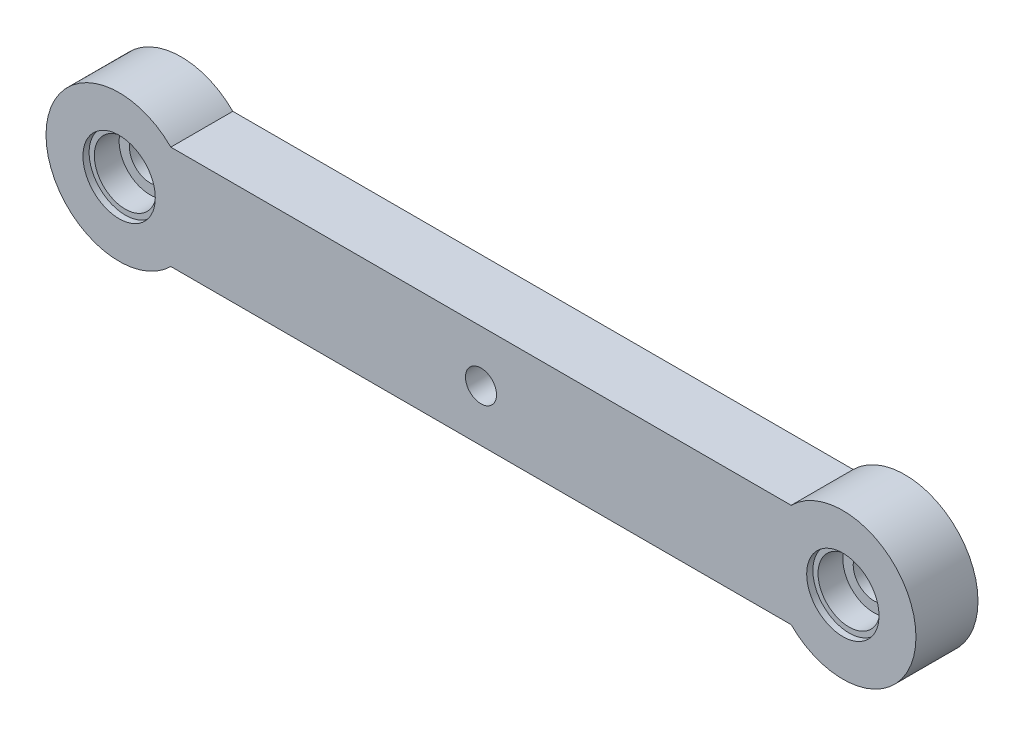
ISO-10303-21;
HEADER;
FILE_DESCRIPTION(('STEP AP214'),'2;1');
FILE_NAME('part.step','',(''),(''),'','','');
FILE_SCHEMA(('AUTOMOTIVE_DESIGN { 1 0 10303 214 1 1 1 1 }'));
ENDSEC;
DATA;
#1=APPLICATION_CONTEXT('core data for automotive mechanical design processes');
#2=APPLICATION_PROTOCOL_DEFINITION('international standard','automotive_design',2000,#1);
#3=PRODUCT_CONTEXT('',#1,'mechanical');
#4=PRODUCT('Part','Part','',(#3));
#5=PRODUCT_RELATED_PRODUCT_CATEGORY('part','',(#4));
#6=PRODUCT_DEFINITION_FORMATION('','',#4);
#7=PRODUCT_DEFINITION_CONTEXT('part definition',#1,'design');
#8=PRODUCT_DEFINITION('design','',#6,#7);
#9=PRODUCT_DEFINITION_SHAPE('','',#8);
#10=(LENGTH_UNIT() NAMED_UNIT(*) SI_UNIT(.MILLI.,.METRE.));
#11=(NAMED_UNIT(*) PLANE_ANGLE_UNIT() SI_UNIT($,.RADIAN.));
#12=(NAMED_UNIT(*) SI_UNIT($,.STERADIAN.) SOLID_ANGLE_UNIT());
#13=UNCERTAINTY_MEASURE_WITH_UNIT(LENGTH_MEASURE(1.E-05),#10,'distance_accuracy_value','');
#14=(GEOMETRIC_REPRESENTATION_CONTEXT(3) GLOBAL_UNCERTAINTY_ASSIGNED_CONTEXT((#13)) GLOBAL_UNIT_ASSIGNED_CONTEXT((#10,
#11,#12)) REPRESENTATION_CONTEXT('',''));
#15=CARTESIAN_POINT('',(0.,0.,0.));
#16=DIRECTION('',(0.,0.,1.));
#17=DIRECTION('',(1.,0.,0.));
#18=AXIS2_PLACEMENT_3D('',#15,#16,#17);
#19=CARTESIAN_POINT('',(0.,0.,6.));
#20=DIRECTION('',(0.,0.,-1.));
#21=DIRECTION('',(-1.,0.,0.));
#22=AXIS2_PLACEMENT_3D('',#19,#20,#21);
#23=PLANE('',#22);
#24=CARTESIAN_POINT('',(0.,0.,6.));
#25=DIRECTION('',(0.,0.,-1.));
#26=DIRECTION('',(-1.,0.,0.));
#27=AXIS2_PLACEMENT_3D('',#24,#25,#26);
#28=CIRCLE('',#27,1.5);
#29=CARTESIAN_POINT('',(-1.5,0.,6.));
#30=VERTEX_POINT('',#29);
#31=EDGE_CURVE('E233',#30,#30,#28,.F.);
#32=ORIENTED_EDGE('',*,*,#31,.F.);
#33=EDGE_LOOP('',(#32));
#34=FACE_BOUND('',#33,.T.);
#35=CARTESIAN_POINT('',(-34.9999999999999,0.,6.));
#36=DIRECTION('',(0.,0.,1.));
#37=DIRECTION('',(1.,0.,0.));
#38=AXIS2_PLACEMENT_3D('',#35,#36,#37);
#39=CIRCLE('',#38,7.07106781186556);
#40=CARTESIAN_POINT('',(-29.9999999999998,5.,6.));
#41=VERTEX_POINT('',#40);
#42=CARTESIAN_POINT('',(-29.9999999999997,-5.,6.));
#43=VERTEX_POINT('',#42);
#44=EDGE_CURVE('E168',#41,#43,#39,.T.);
#45=ORIENTED_EDGE('',*,*,#44,.T.);
#46=DIRECTION('',(1.,0.,0.));
#47=VECTOR('',#46,1.);
#48=CARTESIAN_POINT('',(-40.,-5.,6.));
#49=LINE('',#48,#47);
#50=CARTESIAN_POINT('',(29.9999999999998,-5.,6.));
#51=VERTEX_POINT('',#50);
#52=EDGE_CURVE('E177',#43,#51,#49,.T.);
#53=ORIENTED_EDGE('',*,*,#52,.T.);
#54=CARTESIAN_POINT('',(34.9999999999999,0.,6.));
#55=DIRECTION('',(0.,0.,-1.));
#56=DIRECTION('',(-1.,0.,0.));
#57=AXIS2_PLACEMENT_3D('',#54,#55,#56);
#58=CIRCLE('',#57,7.07106781186556);
#59=CARTESIAN_POINT('',(29.9999999999998,5.,6.));
#60=VERTEX_POINT('',#59);
#61=EDGE_CURVE('E169',#60,#51,#58,.T.);
#62=ORIENTED_EDGE('',*,*,#61,.F.);
#63=DIRECTION('',(1.,0.,0.));
#64=VECTOR('',#63,1.);
#65=CARTESIAN_POINT('',(-40.,5.,6.));
#66=LINE('',#65,#64);
#67=EDGE_CURVE('E190',#41,#60,#66,.T.);
#68=ORIENTED_EDGE('',*,*,#67,.F.);
#69=EDGE_LOOP('',(#45,#53,#62,#68));
#70=FACE_BOUND('',#69,.T.);
#71=CARTESIAN_POINT('',(34.9999999999999,0.,6.));
#72=DIRECTION('',(0.,0.,-1.));
#73=DIRECTION('',(-1.,0.,0.));
#74=AXIS2_PLACEMENT_3D('',#71,#72,#73);
#75=CIRCLE('',#74,3.5);
#76=CARTESIAN_POINT('',(31.4999999999999,0.,6.));
#77=VERTEX_POINT('',#76);
#78=EDGE_CURVE('E230',#77,#77,#75,.T.);
#79=ORIENTED_EDGE('',*,*,#78,.T.);
#80=EDGE_LOOP('',(#79));
#81=FACE_BOUND('',#80,.T.);
#82=CARTESIAN_POINT('',(-34.9999999999999,0.,6.));
#83=DIRECTION('',(0.,0.,1.));
#84=DIRECTION('',(1.,0.,0.));
#85=AXIS2_PLACEMENT_3D('',#82,#83,#84);
#86=CIRCLE('',#85,3.5);
#87=CARTESIAN_POINT('',(-31.4999999999998,0.,6.));
#88=VERTEX_POINT('',#87);
#89=EDGE_CURVE('E224',#88,#88,#86,.T.);
#90=ORIENTED_EDGE('',*,*,#89,.F.);
#91=EDGE_LOOP('',(#90));
#92=FACE_BOUND('',#91,.T.);
#93=ADVANCED_FACE('F116',(#34,#70,#81,#92),#23,.F.);
#94=CARTESIAN_POINT('',(-34.9999999999999,0.,3.));
#95=DIRECTION('',(0.,0.,1.));
#96=DIRECTION('',(1.,0.,0.));
#97=AXIS2_PLACEMENT_3D('',#94,#95,#96);
#98=CYLINDRICAL_SURFACE('',#97,3.);
#99=CARTESIAN_POINT('',(-34.9999999999999,0.,3.));
#100=DIRECTION('',(0.,0.,1.));
#101=DIRECTION('',(1.,0.,0.));
#102=AXIS2_PLACEMENT_3D('',#99,#100,#101);
#103=CIRCLE('',#102,3.);
#104=CARTESIAN_POINT('',(-31.9999999999998,0.,3.));
#105=VERTEX_POINT('',#104);
#106=EDGE_CURVE('E212',#105,#105,#103,.T.);
#107=ORIENTED_EDGE('',*,*,#106,.F.);
#108=EDGE_LOOP('',(#107));
#109=FACE_BOUND('',#108,.T.);
#110=CARTESIAN_POINT('',(-34.9999999999999,0.,5.4));
#111=DIRECTION('',(0.,0.,1.));
#112=DIRECTION('',(1.,0.,0.));
#113=AXIS2_PLACEMENT_3D('',#110,#111,#112);
#114=CIRCLE('',#113,3.);
#115=CARTESIAN_POINT('',(-31.9999999999998,0.,5.4));
#116=VERTEX_POINT('',#115);
#117=EDGE_CURVE('E120',#116,#116,#114,.F.);
#118=ORIENTED_EDGE('',*,*,#117,.F.);
#119=EDGE_LOOP('',(#118));
#120=FACE_BOUND('',#119,.T.);
#121=ADVANCED_FACE('F268',(#109,#120),#98,.F.);
#122=CARTESIAN_POINT('',(0.,0.,0.));
#123=DIRECTION('',(0.,0.,-1.));
#124=DIRECTION('',(-1.,0.,0.));
#125=AXIS2_PLACEMENT_3D('',#122,#123,#124);
#126=PLANE('',#125);
#127=CARTESIAN_POINT('',(0.,0.,0.));
#128=DIRECTION('',(0.,0.,1.));
#129=DIRECTION('',(1.,0.,0.));
#130=AXIS2_PLACEMENT_3D('',#127,#128,#129);
#131=CIRCLE('',#130,1.5);
#132=CARTESIAN_POINT('',(1.5,0.,0.));
#133=VERTEX_POINT('',#132);
#134=EDGE_CURVE('E418',#133,#133,#131,.T.);
#135=ORIENTED_EDGE('',*,*,#134,.T.);
#136=EDGE_LOOP('',(#135));
#137=FACE_BOUND('',#136,.T.);
#138=CARTESIAN_POINT('',(34.9999999999999,0.,0.));
#139=DIRECTION('',(0.,0.,-1.));
#140=DIRECTION('',(-1.,0.,0.));
#141=AXIS2_PLACEMENT_3D('',#138,#139,#140);
#142=CIRCLE('',#141,2.);
#143=CARTESIAN_POINT('',(32.9999999999999,0.,0.));
#144=VERTEX_POINT('',#143);
#145=EDGE_CURVE('E222',#144,#144,#142,.T.);
#146=ORIENTED_EDGE('',*,*,#145,.F.);
#147=EDGE_LOOP('',(#146));
#148=FACE_BOUND('',#147,.T.);
#149=DIRECTION('',(1.,0.,0.));
#150=VECTOR('',#149,1.);
#151=CARTESIAN_POINT('',(-40.,-5.,0.));
#152=LINE('',#151,#150);
#153=CARTESIAN_POINT('',(-29.9999999999997,-5.,0.));
#154=VERTEX_POINT('',#153);
#155=CARTESIAN_POINT('',(29.9999999999998,-5.,0.));
#156=VERTEX_POINT('',#155);
#157=EDGE_CURVE('E175',#154,#156,#152,.T.);
#158=ORIENTED_EDGE('',*,*,#157,.F.);
#159=CARTESIAN_POINT('',(-34.9999999999999,0.,0.));
#160=DIRECTION('',(0.,0.,1.));
#161=DIRECTION('',(1.,0.,0.));
#162=AXIS2_PLACEMENT_3D('',#159,#160,#161);
#163=CIRCLE('',#162,7.07106781186556);
#164=CARTESIAN_POINT('',(-29.9999999999998,5.,0.));
#165=VERTEX_POINT('',#164);
#166=EDGE_CURVE('E160',#165,#154,#163,.T.);
#167=ORIENTED_EDGE('',*,*,#166,.F.);
#168=DIRECTION('',(1.,0.,0.));
#169=VECTOR('',#168,1.);
#170=CARTESIAN_POINT('',(-40.,5.,0.));
#171=LINE('',#170,#169);
#172=CARTESIAN_POINT('',(29.9999999999998,5.,0.));
#173=VERTEX_POINT('',#172);
#174=EDGE_CURVE('E183',#165,#173,#171,.T.);
#175=ORIENTED_EDGE('',*,*,#174,.T.);
#176=CARTESIAN_POINT('',(34.9999999999999,0.,0.));
#177=DIRECTION('',(0.,0.,-1.));
#178=DIRECTION('',(-1.,0.,0.));
#179=AXIS2_PLACEMENT_3D('',#176,#177,#178);
#180=CIRCLE('',#179,7.07106781186556);
#181=EDGE_CURVE('E180',#173,#156,#180,.T.);
#182=ORIENTED_EDGE('',*,*,#181,.T.);
#183=EDGE_LOOP('',(#158,#167,#175,#182));
#184=FACE_BOUND('',#183,.T.);
#185=CARTESIAN_POINT('',(-34.9999999999999,0.,0.));
#186=DIRECTION('',(0.,0.,1.));
#187=DIRECTION('',(1.,0.,0.));
#188=AXIS2_PLACEMENT_3D('',#185,#186,#187);
#189=CIRCLE('',#188,2.);
#190=CARTESIAN_POINT('',(-32.9999999999999,0.,0.));
#191=VERTEX_POINT('',#190);
#192=EDGE_CURVE('E209',#191,#191,#189,.T.);
#193=ORIENTED_EDGE('',*,*,#192,.T.);
#194=EDGE_LOOP('',(#193));
#195=FACE_BOUND('',#194,.T.);
#196=ADVANCED_FACE('F178',(#137,#148,#184,#195),#126,.T.);
#197=CARTESIAN_POINT('',(-40.,5.,6.));
#198=DIRECTION('',(0.,1.,0.));
#199=DIRECTION('',(0.,0.,1.));
#200=AXIS2_PLACEMENT_3D('',#197,#198,#199);
#201=PLANE('',#200);
#202=ORIENTED_EDGE('',*,*,#174,.F.);
#203=DIRECTION('',(0.,0.,-1.));
#204=VECTOR('',#203,1.);
#205=CARTESIAN_POINT('',(-29.9999999999998,5.,6.));
#206=LINE('',#205,#204);
#207=EDGE_CURVE('E142',#165,#41,#206,.F.);
#208=ORIENTED_EDGE('',*,*,#207,.T.);
#209=ORIENTED_EDGE('',*,*,#67,.T.);
#210=DIRECTION('',(0.,0.,-1.));
#211=VECTOR('',#210,1.);
#212=CARTESIAN_POINT('',(29.9999999999998,5.,6.));
#213=LINE('',#212,#211);
#214=EDGE_CURVE('E134',#173,#60,#213,.F.);
#215=ORIENTED_EDGE('',*,*,#214,.F.);
#216=EDGE_LOOP('',(#202,#208,#209,#215));
#217=FACE_BOUND('',#216,.T.);
#218=ADVANCED_FACE('F258',(#217),#201,.T.);
#219=CARTESIAN_POINT('',(-40.,-5.,6.));
#220=DIRECTION('',(0.,1.,0.));
#221=DIRECTION('',(0.,0.,1.));
#222=AXIS2_PLACEMENT_3D('',#219,#220,#221);
#223=PLANE('',#222);
#224=DIRECTION('',(0.,0.,-1.));
#225=VECTOR('',#224,1.);
#226=CARTESIAN_POINT('',(-29.9999999999997,-5.,6.));
#227=LINE('',#226,#225);
#228=EDGE_CURVE('E12',#154,#43,#227,.F.);
#229=ORIENTED_EDGE('',*,*,#228,.F.);
#230=ORIENTED_EDGE('',*,*,#157,.T.);
#231=DIRECTION('',(0.,0.,-1.));
#232=VECTOR('',#231,1.);
#233=CARTESIAN_POINT('',(29.9999999999998,-5.,6.));
#234=LINE('',#233,#232);
#235=EDGE_CURVE('E126',#156,#51,#234,.F.);
#236=ORIENTED_EDGE('',*,*,#235,.T.);
#237=ORIENTED_EDGE('',*,*,#52,.F.);
#238=EDGE_LOOP('',(#229,#230,#236,#237));
#239=FACE_BOUND('',#238,.T.);
#240=ADVANCED_FACE('F173',(#239),#223,.F.);
#241=CARTESIAN_POINT('',(34.9999999999999,0.,6.));
#242=DIRECTION('',(0.,0.,-1.));
#243=DIRECTION('',(-1.,0.,0.));
#244=AXIS2_PLACEMENT_3D('',#241,#242,#243);
#245=CYLINDRICAL_SURFACE('',#244,7.07106781186556);
#246=ORIENTED_EDGE('',*,*,#235,.F.);
#247=ORIENTED_EDGE('',*,*,#181,.F.);
#248=ORIENTED_EDGE('',*,*,#214,.T.);
#249=ORIENTED_EDGE('',*,*,#61,.T.);
#250=EDGE_LOOP('',(#246,#247,#248,#249));
#251=FACE_BOUND('',#250,.T.);
#252=ADVANCED_FACE('F118',(#251),#245,.T.);
#253=CARTESIAN_POINT('',(-34.9999999999999,0.,6.));
#254=DIRECTION('',(0.,0.,-1.));
#255=DIRECTION('',(-1.,0.,0.));
#256=AXIS2_PLACEMENT_3D('',#253,#254,#255);
#257=CYLINDRICAL_SURFACE('',#256,7.07106781186556);
#258=ORIENTED_EDGE('',*,*,#166,.T.);
#259=ORIENTED_EDGE('',*,*,#228,.T.);
#260=ORIENTED_EDGE('',*,*,#44,.F.);
#261=ORIENTED_EDGE('',*,*,#207,.F.);
#262=EDGE_LOOP('',(#258,#259,#260,#261));
#263=FACE_BOUND('',#262,.T.);
#264=ADVANCED_FACE('F162',(#263),#257,.T.);
#265=CARTESIAN_POINT('',(-34.9999999999999,0.,3.));
#266=DIRECTION('',(0.,0.,1.));
#267=DIRECTION('',(1.,0.,0.));
#268=AXIS2_PLACEMENT_3D('',#265,#266,#267);
#269=PLANE('',#268);
#270=CARTESIAN_POINT('',(-34.9999999999999,0.,3.));
#271=DIRECTION('',(0.,0.,1.));
#272=DIRECTION('',(1.,0.,0.));
#273=AXIS2_PLACEMENT_3D('',#270,#271,#272);
#274=CIRCLE('',#273,2.);
#275=CARTESIAN_POINT('',(-32.9999999999999,0.,3.));
#276=VERTEX_POINT('',#275);
#277=EDGE_CURVE('E208',#276,#276,#274,.T.);
#278=ORIENTED_EDGE('',*,*,#277,.F.);
#279=EDGE_LOOP('',(#278));
#280=FACE_BOUND('',#279,.T.);
#281=ORIENTED_EDGE('',*,*,#106,.T.);
#282=EDGE_LOOP('',(#281));
#283=FACE_BOUND('',#282,.T.);
#284=ADVANCED_FACE('F265',(#280,#283),#269,.T.);
#285=CARTESIAN_POINT('',(34.9999999999999,0.,3.));
#286=DIRECTION('',(0.,0.,1.));
#287=DIRECTION('',(1.,0.,0.));
#288=AXIS2_PLACEMENT_3D('',#285,#286,#287);
#289=CYLINDRICAL_SURFACE('',#288,3.);
#290=CARTESIAN_POINT('',(34.9999999999999,0.,5.4));
#291=DIRECTION('',(0.,0.,-1.));
#292=DIRECTION('',(-1.,0.,0.));
#293=AXIS2_PLACEMENT_3D('',#290,#291,#292);
#294=CIRCLE('',#293,3.);
#295=CARTESIAN_POINT('',(31.9999999999998,0.,5.4));
#296=VERTEX_POINT('',#295);
#297=EDGE_CURVE('E213',#296,#296,#294,.T.);
#298=ORIENTED_EDGE('',*,*,#297,.F.);
#299=EDGE_LOOP('',(#298));
#300=FACE_BOUND('',#299,.T.);
#301=CARTESIAN_POINT('',(34.9999999999999,0.,3.));
#302=DIRECTION('',(0.,0.,-1.));
#303=DIRECTION('',(-1.,0.,0.));
#304=AXIS2_PLACEMENT_3D('',#301,#302,#303);
#305=CIRCLE('',#304,3.);
#306=CARTESIAN_POINT('',(31.9999999999998,0.,3.));
#307=VERTEX_POINT('',#306);
#308=EDGE_CURVE('E197',#307,#307,#305,.T.);
#309=ORIENTED_EDGE('',*,*,#308,.T.);
#310=EDGE_LOOP('',(#309));
#311=FACE_BOUND('',#310,.T.);
#312=ADVANCED_FACE('F311',(#300,#311),#289,.F.);
#313=CARTESIAN_POINT('',(34.9999999999999,0.,3.));
#314=DIRECTION('',(0.,0.,-1.));
#315=DIRECTION('',(-1.,0.,0.));
#316=AXIS2_PLACEMENT_3D('',#313,#314,#315);
#317=PLANE('',#316);
#318=CARTESIAN_POINT('',(34.9999999999999,0.,3.));
#319=DIRECTION('',(0.,0.,-1.));
#320=DIRECTION('',(-1.,0.,0.));
#321=AXIS2_PLACEMENT_3D('',#318,#319,#320);
#322=CIRCLE('',#321,2.);
#323=CARTESIAN_POINT('',(32.9999999999999,0.,3.));
#324=VERTEX_POINT('',#323);
#325=EDGE_CURVE('E204',#324,#324,#322,.F.);
#326=ORIENTED_EDGE('',*,*,#325,.F.);
#327=EDGE_LOOP('',(#326));
#328=FACE_BOUND('',#327,.T.);
#329=ORIENTED_EDGE('',*,*,#308,.F.);
#330=EDGE_LOOP('',(#329));
#331=FACE_BOUND('',#330,.T.);
#332=ADVANCED_FACE('F321',(#328,#331),#317,.F.);
#333=CARTESIAN_POINT('',(34.9999999999999,0.,0.));
#334=DIRECTION('',(0.,0.,1.));
#335=DIRECTION('',(1.,0.,0.));
#336=AXIS2_PLACEMENT_3D('',#333,#334,#335);
#337=CYLINDRICAL_SURFACE('',#336,2.);
#338=ORIENTED_EDGE('',*,*,#145,.T.);
#339=EDGE_LOOP('',(#338));
#340=FACE_BOUND('',#339,.T.);
#341=ORIENTED_EDGE('',*,*,#325,.T.);
#342=EDGE_LOOP('',(#341));
#343=FACE_BOUND('',#342,.T.);
#344=ADVANCED_FACE('F331',(#340,#343),#337,.F.);
#345=CARTESIAN_POINT('',(-34.9999999999999,0.,0.));
#346=DIRECTION('',(0.,0.,1.));
#347=DIRECTION('',(1.,0.,0.));
#348=AXIS2_PLACEMENT_3D('',#345,#346,#347);
#349=CYLINDRICAL_SURFACE('',#348,2.);
#350=ORIENTED_EDGE('',*,*,#277,.T.);
#351=EDGE_LOOP('',(#350));
#352=FACE_BOUND('',#351,.T.);
#353=ORIENTED_EDGE('',*,*,#192,.F.);
#354=EDGE_LOOP('',(#353));
#355=FACE_BOUND('',#354,.T.);
#356=ADVANCED_FACE('F346',(#352,#355),#349,.F.);
#357=CARTESIAN_POINT('',(34.9999999999999,0.,5.4));
#358=DIRECTION('',(0.,0.,1.));
#359=DIRECTION('',(1.,0.,0.));
#360=AXIS2_PLACEMENT_3D('',#357,#358,#359);
#361=CYLINDRICAL_SURFACE('',#360,3.5);
#362=CARTESIAN_POINT('',(34.9999999999999,0.,5.4));
#363=DIRECTION('',(0.,0.,-1.));
#364=DIRECTION('',(-1.,0.,0.));
#365=AXIS2_PLACEMENT_3D('',#362,#363,#364);
#366=CIRCLE('',#365,3.5);
#367=CARTESIAN_POINT('',(31.4999999999999,0.,5.4));
#368=VERTEX_POINT('',#367);
#369=EDGE_CURVE('E239',#368,#368,#366,.T.);
#370=ORIENTED_EDGE('',*,*,#369,.T.);
#371=EDGE_LOOP('',(#370));
#372=FACE_BOUND('',#371,.T.);
#373=ORIENTED_EDGE('',*,*,#78,.F.);
#374=EDGE_LOOP('',(#373));
#375=FACE_BOUND('',#374,.T.);
#376=ADVANCED_FACE('F356',(#372,#375),#361,.F.);
#377=CARTESIAN_POINT('',(34.9999999999999,0.,5.4));
#378=DIRECTION('',(0.,0.,-1.));
#379=DIRECTION('',(-1.,0.,0.));
#380=AXIS2_PLACEMENT_3D('',#377,#378,#379);
#381=PLANE('',#380);
#382=ORIENTED_EDGE('',*,*,#297,.T.);
#383=EDGE_LOOP('',(#382));
#384=FACE_BOUND('',#383,.T.);
#385=ORIENTED_EDGE('',*,*,#369,.F.);
#386=EDGE_LOOP('',(#385));
#387=FACE_BOUND('',#386,.T.);
#388=ADVANCED_FACE('F374',(#384,#387),#381,.F.);
#389=CARTESIAN_POINT('',(-34.9999999999999,0.,5.4));
#390=DIRECTION('',(0.,0.,1.));
#391=DIRECTION('',(1.,0.,0.));
#392=AXIS2_PLACEMENT_3D('',#389,#390,#391);
#393=PLANE('',#392);
#394=CARTESIAN_POINT('',(-34.9999999999999,0.,5.4));
#395=DIRECTION('',(0.,0.,1.));
#396=DIRECTION('',(1.,0.,0.));
#397=AXIS2_PLACEMENT_3D('',#394,#395,#396);
#398=CIRCLE('',#397,3.5);
#399=CARTESIAN_POINT('',(-31.4999999999998,0.,5.4));
#400=VERTEX_POINT('',#399);
#401=EDGE_CURVE('E216',#400,#400,#398,.T.);
#402=ORIENTED_EDGE('',*,*,#401,.T.);
#403=EDGE_LOOP('',(#402));
#404=FACE_BOUND('',#403,.T.);
#405=ORIENTED_EDGE('',*,*,#117,.T.);
#406=EDGE_LOOP('',(#405));
#407=FACE_BOUND('',#406,.T.);
#408=ADVANCED_FACE('F384',(#404,#407),#393,.T.);
#409=CARTESIAN_POINT('',(-34.9999999999999,0.,5.4));
#410=DIRECTION('',(0.,0.,1.));
#411=DIRECTION('',(1.,0.,0.));
#412=AXIS2_PLACEMENT_3D('',#409,#410,#411);
#413=CYLINDRICAL_SURFACE('',#412,3.5);
#414=ORIENTED_EDGE('',*,*,#401,.F.);
#415=EDGE_LOOP('',(#414));
#416=FACE_BOUND('',#415,.T.);
#417=ORIENTED_EDGE('',*,*,#89,.T.);
#418=EDGE_LOOP('',(#417));
#419=FACE_BOUND('',#418,.T.);
#420=ADVANCED_FACE('F393',(#416,#419),#413,.F.);
#421=CARTESIAN_POINT('',(0.,0.,30.));
#422=DIRECTION('',(0.,0.,-1.));
#423=DIRECTION('',(-1.,0.,0.));
#424=AXIS2_PLACEMENT_3D('',#421,#422,#423);
#425=CYLINDRICAL_SURFACE('',#424,1.5);
#426=ORIENTED_EDGE('',*,*,#134,.F.);
#427=EDGE_LOOP('',(#426));
#428=FACE_BOUND('',#427,.T.);
#429=ORIENTED_EDGE('',*,*,#31,.T.);
#430=EDGE_LOOP('',(#429));
#431=FACE_BOUND('',#430,.T.);
#432=ADVANCED_FACE('F401',(#428,#431),#425,.F.);
#433=CLOSED_SHELL('',(#93,#121,#196,#218,#240,#252,#264,#284,#312,#332,#344,#356,#376,#388,#408,
#420,#432));
#434=MANIFOLD_SOLID_BREP('B2',#433);
#435=ADVANCED_BREP_SHAPE_REPRESENTATION('',(#18,#434),#14);
#436=SHAPE_DEFINITION_REPRESENTATION(#9,#435);
ENDSEC;
END-ISO-10303-21;
